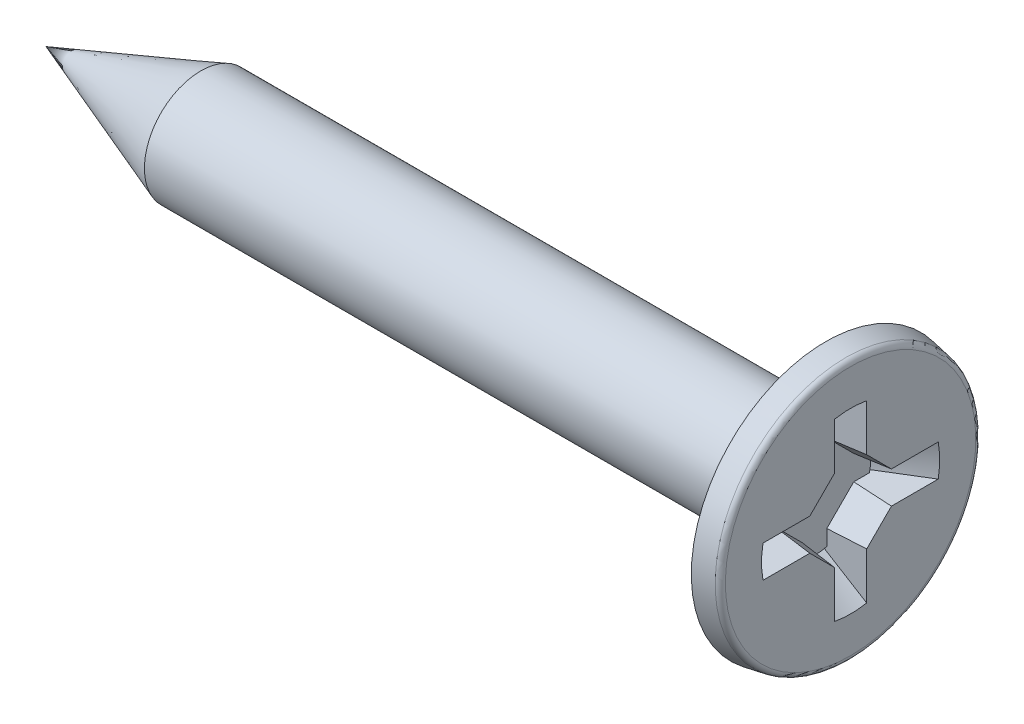
ISO-10303-21;
HEADER;
FILE_DESCRIPTION(('STEP AP214'),'2;1');
FILE_NAME('part.step','',(''),(''),'','','');
FILE_SCHEMA(('AUTOMOTIVE_DESIGN { 1 0 10303 214 1 1 1 1 }'));
ENDSEC;
DATA;
#1=APPLICATION_CONTEXT('core data for automotive mechanical design processes');
#2=APPLICATION_PROTOCOL_DEFINITION('international standard','automotive_design',2000,#1);
#3=PRODUCT_CONTEXT('',#1,'mechanical');
#4=PRODUCT('Part','Part','',(#3));
#5=PRODUCT_RELATED_PRODUCT_CATEGORY('part','',(#4));
#6=PRODUCT_DEFINITION_FORMATION('','',#4);
#7=PRODUCT_DEFINITION_CONTEXT('part definition',#1,'design');
#8=PRODUCT_DEFINITION('design','',#6,#7);
#9=PRODUCT_DEFINITION_SHAPE('','',#8);
#10=(LENGTH_UNIT() NAMED_UNIT(*) SI_UNIT(.MILLI.,.METRE.));
#11=(NAMED_UNIT(*) PLANE_ANGLE_UNIT() SI_UNIT($,.RADIAN.));
#12=(NAMED_UNIT(*) SI_UNIT($,.STERADIAN.) SOLID_ANGLE_UNIT());
#13=UNCERTAINTY_MEASURE_WITH_UNIT(LENGTH_MEASURE(1.E-05),#10,'distance_accuracy_value','');
#14=(GEOMETRIC_REPRESENTATION_CONTEXT(3) GLOBAL_UNCERTAINTY_ASSIGNED_CONTEXT((#13)) GLOBAL_UNIT_ASSIGNED_CONTEXT((#10,
#11,#12)) REPRESENTATION_CONTEXT('',''));
#15=CARTESIAN_POINT('',(0.,0.,0.));
#16=DIRECTION('',(0.,0.,1.));
#17=DIRECTION('',(1.,0.,0.));
#18=AXIS2_PLACEMENT_3D('',#15,#16,#17);
#19=CARTESIAN_POINT('',(21.0058,0.,0.));
#20=DIRECTION('',(1.,0.,0.));
#21=DIRECTION('',(0.,0.,-1.));
#22=AXIS2_PLACEMENT_3D('',#19,#20,#21);
#23=CONICAL_SURFACE('',#22,0.25035654622939,0.667320149050341);
#24=CARTESIAN_POINT('',(22.9446761804665,0.,0.));
#25=DIRECTION('',(1.,0.,0.));
#26=DIRECTION('',(0.,0.,-1.));
#27=AXIS2_PLACEMENT_3D('',#24,#25,#26);
#28=CIRCLE('',#27,1.778);
#29=CARTESIAN_POINT('',(22.9446761804665,1.73906089050964,-0.370069208527001));
#30=VERTEX_POINT('',#29);
#31=CARTESIAN_POINT('',(22.9446761804665,1.73906089050964,0.370069208527007));
#32=VERTEX_POINT('',#31);
#33=EDGE_CURVE('E47',#30,#32,#28,.T.);
#34=ORIENTED_EDGE('',*,*,#33,.F.);
#35=CARTESIAN_POINT('',(24.257,2.76571478102859,-0.508));
#36=CARTESIAN_POINT('',(24.0903738580114,2.63544862131671,-0.490486886771015));
#37=CARTESIAN_POINT('',(23.9237562176942,2.50517146963506,-0.472974667103702));
#38=CARTESIAN_POINT('',(23.590554741965,2.24457356091985,-0.437953780807795));
#39=CARTESIAN_POINT('',(23.423970906544,2.11425280389808,-0.420445114178242));
#40=CARTESIAN_POINT('',(23.090853705786,1.85354595646584,-0.385433085538732));
#41=CARTESIAN_POINT('',(22.9243203404631,1.72315986603717,-0.367929723530254));
#42=CARTESIAN_POINT('',(22.59136931793,1.46223832418929,-0.332935160925983));
#43=CARTESIAN_POINT('',(22.424951660755,1.33170287272448,-0.315443960333905));
#44=CARTESIAN_POINT('',(22.2586245043183,1.20105074856376,-0.297962271752712));
#45=B_SPLINE_CURVE_WITH_KNOTS('',3,(#35,#36,#37,#38,#39,#40,#41,#42,#43,#44),.UNSPECIFIED.,.F.,
.F.,(4,2,2,2,4),(0.,0.636680661921654,1.27336115205289,1.91004181972966,2.54672268184246),.UNSPECIFIED.);
#46=CARTESIAN_POINT('',(24.257,2.76571478102859,-0.508));
#47=VERTEX_POINT('',#46);
#48=EDGE_CURVE('E189',#47,#30,#45,.T.);
#49=ORIENTED_EDGE('',*,*,#48,.F.);
#50=CARTESIAN_POINT('',(24.257,0.,0.));
#51=DIRECTION('',(1.,0.,0.));
#52=DIRECTION('',(0.,0.,-1.));
#53=AXIS2_PLACEMENT_3D('',#50,#51,#52);
#54=CIRCLE('',#53,2.81198190783653);
#55=CARTESIAN_POINT('',(24.257,2.76571478102858,0.50800000000001));
#56=VERTEX_POINT('',#55);
#57=EDGE_CURVE('E327',#47,#56,#54,.T.);
#58=ORIENTED_EDGE('',*,*,#57,.T.);
#59=CARTESIAN_POINT('',(22.2586245043184,1.20105074856377,0.297962271752717));
#60=CARTESIAN_POINT('',(22.4583226612367,1.35790009580057,0.318951393819583));
#61=CARTESIAN_POINT('',(22.6581405053032,1.51459509741993,0.339953095512631));
#62=CARTESIAN_POINT('',(23.0579235031304,1.82779489553756,0.381971981771476));
#63=CARTESIAN_POINT('',(23.2578886568436,1.98429969209706,0.402989166332286));
#64=CARTESIAN_POINT('',(23.5910468145409,2.24495362073449,0.438005499719591));
#65=CARTESIAN_POINT('',(23.7242244068001,2.34912268569443,0.452003028708519));
#66=CARTESIAN_POINT('',(23.9905989722724,2.55743581022851,0.480000123706706));
#67=CARTESIAN_POINT('',(24.123795945489,2.66157986979805,0.493999689716341));
#68=CARTESIAN_POINT('',(24.257,2.76571478102858,0.50800000000001));
#69=B_SPLINE_CURVE_WITH_KNOTS('',3,(#59,#60,#61,#62,#63,#64,#65,#66,#67,#68),.UNSPECIFIED.,.F.,
.F.,(4,2,2,2,4),(0.,0.764391301047044,1.52878235599137,2.03775246160172,2.5467226607872),.UNSPECIFIED.);
#70=EDGE_CURVE('E234',#32,#56,#69,.T.);
#71=ORIENTED_EDGE('',*,*,#70,.F.);
#72=EDGE_LOOP('',(#34,#49,#58,#71));
#73=FACE_BOUND('',#72,.T.);
#74=ADVANCED_FACE('F39',(#73),#23,.F.);
#75=CARTESIAN_POINT('',(22.9446761804665,0.370069208526994,1.73906089050964));
#76=VERTEX_POINT('',#75);
#77=CARTESIAN_POINT('',(22.9446761804665,-0.370069208527013,1.73906089050964));
#78=VERTEX_POINT('',#77);
#79=EDGE_CURVE('E205',#76,#78,#28,.T.);
#80=ORIENTED_EDGE('',*,*,#79,.F.);
#81=CARTESIAN_POINT('',(24.257,0.50799999999999,2.76571478102859));
#82=CARTESIAN_POINT('',(24.0903738580114,0.490486886771005,2.63544862131672));
#83=CARTESIAN_POINT('',(23.9237562176942,0.472974667103693,2.50517146963506));
#84=CARTESIAN_POINT('',(23.590554741965,0.437953780807786,2.24457356091985));
#85=CARTESIAN_POINT('',(23.423970906544,0.420445114178234,2.11425280389808));
#86=CARTESIAN_POINT('',(23.090853705786,0.385433085538724,1.85354595646584));
#87=CARTESIAN_POINT('',(22.9243203404631,0.367929723530247,1.72315986603717));
#88=CARTESIAN_POINT('',(22.59136931793,0.332935160925977,1.46223832418929));
#89=CARTESIAN_POINT('',(22.424951660755,0.315443960333899,1.33170287272448));
#90=CARTESIAN_POINT('',(22.2586245043183,0.297962271752708,1.20105074856377));
#91=B_SPLINE_CURVE_WITH_KNOTS('',3,(#81,#82,#83,#84,#85,#86,#87,#88,#89,#90),.UNSPECIFIED.,.F.,
.F.,(4,2,2,2,4),(0.,0.636680661921654,1.27336115205289,1.91004181972966,2.54672268184246),.UNSPECIFIED.);
#92=CARTESIAN_POINT('',(24.257,0.50799999999999,2.76571478102859));
#93=VERTEX_POINT('',#92);
#94=EDGE_CURVE('E190',#93,#76,#91,.T.);
#95=ORIENTED_EDGE('',*,*,#94,.F.);
#96=CARTESIAN_POINT('',(24.257,-0.50800000000002,2.76571478102858));
#97=VERTEX_POINT('',#96);
#98=EDGE_CURVE('E397',#93,#97,#54,.T.);
#99=ORIENTED_EDGE('',*,*,#98,.T.);
#100=CARTESIAN_POINT('',(22.2586245043184,-0.297962271752722,1.20105074856377));
#101=CARTESIAN_POINT('',(22.4583226612367,-0.318951393819589,1.35790009580057));
#102=CARTESIAN_POINT('',(22.6581405053032,-0.339953095512637,1.51459509741993));
#103=CARTESIAN_POINT('',(23.0579235031304,-0.381971981771484,1.82779489553756));
#104=CARTESIAN_POINT('',(23.2578886568436,-0.402989166332294,1.98429969209706));
#105=CARTESIAN_POINT('',(23.5910468145409,-0.438005499719601,2.24495362073449));
#106=CARTESIAN_POINT('',(23.7242244068001,-0.452003028708528,2.34912268569443));
#107=CARTESIAN_POINT('',(23.9905989722724,-0.480000123706716,2.55743581022851));
#108=CARTESIAN_POINT('',(24.123795945489,-0.493999689716351,2.66157986979805));
#109=CARTESIAN_POINT('',(24.257,-0.50800000000002,2.76571478102858));
#110=B_SPLINE_CURVE_WITH_KNOTS('',3,(#100,#101,#102,#103,#104,#105,#106,#107,#108,#109),
.UNSPECIFIED.,.F.,.F.,(4,2,2,2,4),(0.,0.764391301047045,1.52878235599138,2.03775246160172,
2.54672266078719),.UNSPECIFIED.);
#111=EDGE_CURVE('E227',#78,#97,#110,.T.);
#112=ORIENTED_EDGE('',*,*,#111,.F.);
#113=EDGE_LOOP('',(#80,#95,#99,#112));
#114=FACE_BOUND('',#113,.T.);
#115=ADVANCED_FACE('F224',(#114),#23,.F.);
#116=CARTESIAN_POINT('',(22.9446761804665,-1.73906089050965,0.370069208526989));
#117=VERTEX_POINT('',#116);
#118=CARTESIAN_POINT('',(22.9446761804665,-1.73906089050964,-0.370069208527019));
#119=VERTEX_POINT('',#118);
#120=EDGE_CURVE('E202',#117,#119,#28,.T.);
#121=ORIENTED_EDGE('',*,*,#120,.F.);
#122=CARTESIAN_POINT('',(24.257,-2.76571478102859,0.507999999999981));
#123=CARTESIAN_POINT('',(24.0903738580114,-2.63544862131672,0.490486886770996));
#124=CARTESIAN_POINT('',(23.9237562176942,-2.50517146963506,0.472974667103685));
#125=CARTESIAN_POINT('',(23.590554741965,-2.24457356091985,0.437953780807779));
#126=CARTESIAN_POINT('',(23.423970906544,-2.11425280389808,0.420445114178227));
#127=CARTESIAN_POINT('',(23.090853705786,-1.85354595646584,0.385433085538719));
#128=CARTESIAN_POINT('',(22.9243203404631,-1.72315986603717,0.367929723530242));
#129=CARTESIAN_POINT('',(22.59136931793,-1.46223832418929,0.332935160925972));
#130=CARTESIAN_POINT('',(22.424951660755,-1.33170287272448,0.315443960333895));
#131=CARTESIAN_POINT('',(22.2586245043183,-1.20105074856377,0.297962271752704));
#132=B_SPLINE_CURVE_WITH_KNOTS('',3,(#122,#123,#124,#125,#126,#127,#128,#129,#130,#131),
.UNSPECIFIED.,.F.,.F.,(4,2,2,2,4),(0.,0.636680661921654,1.27336115205289,1.91004181972966,
2.54672268184246),.UNSPECIFIED.);
#133=CARTESIAN_POINT('',(24.257,-2.76571478102859,0.507999999999981));
#134=VERTEX_POINT('',#133);
#135=EDGE_CURVE('E236',#134,#117,#132,.T.);
#136=ORIENTED_EDGE('',*,*,#135,.F.);
#137=CARTESIAN_POINT('',(24.257,-2.76571478102858,-0.508000000000029));
#138=VERTEX_POINT('',#137);
#139=EDGE_CURVE('E393',#134,#138,#54,.T.);
#140=ORIENTED_EDGE('',*,*,#139,.T.);
#141=CARTESIAN_POINT('',(22.2586245043184,-1.20105074856377,-0.297962271752725));
#142=CARTESIAN_POINT('',(22.4583226612367,-1.35790009580057,-0.318951393819593));
#143=CARTESIAN_POINT('',(22.6581405053032,-1.51459509741993,-0.339953095512642));
#144=CARTESIAN_POINT('',(23.0579235031304,-1.82779489553756,-0.38197198177149));
#145=CARTESIAN_POINT('',(23.2578886568436,-1.98429969209706,-0.402989166332301));
#146=CARTESIAN_POINT('',(23.5910468145409,-2.24495362073449,-0.438005499719608));
#147=CARTESIAN_POINT('',(23.7242244068001,-2.34912268569443,-0.452003028708535));
#148=CARTESIAN_POINT('',(23.9905989722724,-2.55743581022851,-0.480000123706724));
#149=CARTESIAN_POINT('',(24.123795945489,-2.66157986979805,-0.493999689716359));
#150=CARTESIAN_POINT('',(24.257,-2.76571478102858,-0.508000000000029));
#151=B_SPLINE_CURVE_WITH_KNOTS('',3,(#141,#142,#143,#144,#145,#146,#147,#148,#149,#150),
.UNSPECIFIED.,.F.,.F.,(4,2,2,2,4),(0.,0.764391301047045,1.52878235599138,2.03775246160172,
2.54672266078719),.UNSPECIFIED.);
#152=EDGE_CURVE('E322',#119,#138,#151,.T.);
#153=ORIENTED_EDGE('',*,*,#152,.F.);
#154=EDGE_LOOP('',(#121,#136,#140,#153));
#155=FACE_BOUND('',#154,.T.);
#156=ADVANCED_FACE('F261',(#155),#23,.F.);
#157=CARTESIAN_POINT('',(20.2438,0.,0.));
#158=DIRECTION('',(-1.,0.,0.));
#159=DIRECTION('',(0.,-1.,0.));
#160=AXIS2_PLACEMENT_3D('',#157,#158,#159);
#161=TOROIDAL_SURFACE('',#160,4.2418,3.2258);
#162=CARTESIAN_POINT('',(22.325980395643,0.,0.));
#163=DIRECTION('',(-1.,0.,0.));
#164=DIRECTION('',(0.,-1.,0.));
#165=AXIS2_PLACEMENT_3D('',#162,#163,#164);
#166=CIRCLE('',#165,1.778);
#167=CARTESIAN_POINT('',(22.325980395643,-1.778,0.));
#168=VERTEX_POINT('',#167);
#169=EDGE_CURVE('E410',#168,#168,#166,.F.);
#170=ORIENTED_EDGE('',*,*,#169,.T.);
#171=EDGE_LOOP('',(#170));
#172=FACE_BOUND('',#171,.T.);
#173=CARTESIAN_POINT('',(23.4696,0.,0.));
#174=DIRECTION('',(-1.,0.,0.));
#175=DIRECTION('',(0.,-1.,0.));
#176=AXIS2_PLACEMENT_3D('',#173,#174,#175);
#177=CIRCLE('',#176,4.2418);
#178=CARTESIAN_POINT('',(23.4696,-4.2418,0.));
#179=VERTEX_POINT('',#178);
#180=EDGE_CURVE('E372',#179,#179,#177,.T.);
#181=ORIENTED_EDGE('',*,*,#180,.T.);
#182=EDGE_LOOP('',(#181));
#183=FACE_BOUND('',#182,.T.);
#184=ADVANCED_FACE('F264',(#172,#183),#161,.F.);
#185=CARTESIAN_POINT('',(24.257,0.,0.));
#186=DIRECTION('',(-1.,0.,0.));
#187=DIRECTION('',(0.,-1.,0.));
#188=AXIS2_PLACEMENT_3D('',#185,#186,#187);
#189=PLANE('',#188);
#190=CARTESIAN_POINT('',(24.257,0.,0.));
#191=DIRECTION('',(-1.,0.,0.));
#192=DIRECTION('',(0.,-1.,0.));
#193=AXIS2_PLACEMENT_3D('',#190,#191,#192);
#194=CIRCLE('',#193,3.95376822096684);
#195=CARTESIAN_POINT('',(24.257,-3.95376822096684,0.));
#196=VERTEX_POINT('',#195);
#197=EDGE_CURVE('E203',#196,#196,#194,.F.);
#198=ORIENTED_EDGE('',*,*,#197,.T.);
#199=EDGE_LOOP('',(#198));
#200=FACE_BOUND('',#199,.T.);
#201=DIRECTION('',(0.,0.,-1.));
#202=VECTOR('',#201,1.);
#203=CARTESIAN_POINT('',(24.257,-0.50800000000002,2.81198190783653));
#204=LINE('',#203,#202);
#205=CARTESIAN_POINT('',(24.257,-0.50800000000001,1.28805122421383));
#206=VERTEX_POINT('',#205);
#207=EDGE_CURVE('E334',#97,#206,#204,.T.);
#208=ORIENTED_EDGE('',*,*,#207,.F.);
#209=ORIENTED_EDGE('',*,*,#98,.F.);
#210=DIRECTION('',(0.,0.,1.));
#211=VECTOR('',#210,1.);
#212=CARTESIAN_POINT('',(24.257,0.507999999999989,2.81198190783654));
#213=LINE('',#212,#211);
#214=CARTESIAN_POINT('',(24.257,0.507999999999995,1.28805122421383));
#215=VERTEX_POINT('',#214);
#216=EDGE_CURVE('E233',#215,#93,#213,.T.);
#217=ORIENTED_EDGE('',*,*,#216,.F.);
#218=DIRECTION('',(0.,-0.707106781186551,0.707106781186544));
#219=VECTOR('',#218,1.);
#220=CARTESIAN_POINT('',(24.257,0.507999999999995,1.28805122421383));
#221=LINE('',#220,#219);
#222=CARTESIAN_POINT('',(24.257,1.28805122421383,0.508000000000004));
#223=VERTEX_POINT('',#222);
#224=EDGE_CURVE('E356',#223,#215,#221,.T.);
#225=ORIENTED_EDGE('',*,*,#224,.F.);
#226=DIRECTION('',(0.,-1.,0.));
#227=VECTOR('',#226,1.);
#228=CARTESIAN_POINT('',(24.257,2.81198190783653,0.50800000000001));
#229=LINE('',#228,#227);
#230=EDGE_CURVE('E353',#56,#223,#229,.T.);
#231=ORIENTED_EDGE('',*,*,#230,.F.);
#232=ORIENTED_EDGE('',*,*,#57,.F.);
#233=DIRECTION('',(0.,1.,0.));
#234=VECTOR('',#233,1.);
#235=CARTESIAN_POINT('',(24.257,2.81198190783653,-0.508));
#236=LINE('',#235,#234);
#237=CARTESIAN_POINT('',(24.257,1.28805122421383,-0.508));
#238=VERTEX_POINT('',#237);
#239=EDGE_CURVE('E368',#238,#47,#236,.T.);
#240=ORIENTED_EDGE('',*,*,#239,.F.);
#241=DIRECTION('',(0.,0.707106781186546,0.707106781186549));
#242=VECTOR('',#241,1.);
#243=CARTESIAN_POINT('',(24.257,1.28805122421383,-0.508));
#244=LINE('',#243,#242);
#245=CARTESIAN_POINT('',(24.257,0.507999999999999,-1.28805122421383));
#246=VERTEX_POINT('',#245);
#247=EDGE_CURVE('E364',#246,#238,#244,.T.);
#248=ORIENTED_EDGE('',*,*,#247,.F.);
#249=DIRECTION('',(0.,0.,1.));
#250=VECTOR('',#249,1.);
#251=CARTESIAN_POINT('',(24.257,0.507999999999999,-2.81198190783654));
#252=LINE('',#251,#250);
#253=CARTESIAN_POINT('',(24.257,0.507999999999999,-2.76571478102859));
#254=VERTEX_POINT('',#253);
#255=EDGE_CURVE('E362',#254,#246,#252,.T.);
#256=ORIENTED_EDGE('',*,*,#255,.F.);
#257=CARTESIAN_POINT('',(24.257,-0.507999999999972,-2.76571478102859));
#258=VERTEX_POINT('',#257);
#259=EDGE_CURVE('E186',#258,#254,#54,.T.);
#260=ORIENTED_EDGE('',*,*,#259,.F.);
#261=DIRECTION('',(0.,0.,-1.));
#262=VECTOR('',#261,1.);
#263=CARTESIAN_POINT('',(24.257,-0.507999999999971,-2.81198190783654));
#264=LINE('',#263,#262);
#265=CARTESIAN_POINT('',(24.257,-0.507999999999988,-1.28805122421383));
#266=VERTEX_POINT('',#265);
#267=EDGE_CURVE('E329',#266,#258,#264,.T.);
#268=ORIENTED_EDGE('',*,*,#267,.F.);
#269=DIRECTION('',(0.,0.707106781186556,-0.707106781186539));
#270=VECTOR('',#269,1.);
#271=CARTESIAN_POINT('',(24.257,-0.507999999999988,-1.28805122421383));
#272=LINE('',#271,#270);
#273=CARTESIAN_POINT('',(24.257,-1.28805122421383,-0.508000000000013));
#274=VERTEX_POINT('',#273);
#275=EDGE_CURVE('E336',#274,#266,#272,.T.);
#276=ORIENTED_EDGE('',*,*,#275,.F.);
#277=DIRECTION('',(0.,1.,0.));
#278=VECTOR('',#277,1.);
#279=CARTESIAN_POINT('',(24.257,-2.81198190783653,-0.508000000000029));
#280=LINE('',#279,#278);
#281=EDGE_CURVE('E340',#138,#274,#280,.T.);
#282=ORIENTED_EDGE('',*,*,#281,.F.);
#283=ORIENTED_EDGE('',*,*,#139,.F.);
#284=DIRECTION('',(0.,-1.,0.));
#285=VECTOR('',#284,1.);
#286=CARTESIAN_POINT('',(24.257,-2.81198190783654,0.50799999999998));
#287=LINE('',#286,#285);
#288=CARTESIAN_POINT('',(24.257,-1.28805122421383,0.507999999999991));
#289=VERTEX_POINT('',#288);
#290=EDGE_CURVE('E349',#289,#134,#287,.T.);
#291=ORIENTED_EDGE('',*,*,#290,.F.);
#292=DIRECTION('',(0.,-0.707106781186541,-0.707106781186554));
#293=VECTOR('',#292,1.);
#294=CARTESIAN_POINT('',(24.257,-1.28805122421383,0.507999999999991));
#295=LINE('',#294,#293);
#296=EDGE_CURVE('E346',#206,#289,#295,.T.);
#297=ORIENTED_EDGE('',*,*,#296,.F.);
#298=EDGE_LOOP('',(#208,#209,#217,#225,#231,#232,#240,#248,#256,#260,#268,#276,#282,#283,#291,#297));
#299=FACE_BOUND('',#298,.T.);
#300=ADVANCED_FACE('F390',(#200,#299),#189,.F.);
#301=CARTESIAN_POINT('',(24.257,0.,0.));
#302=DIRECTION('',(-1.,0.,0.));
#303=DIRECTION('',(0.,-1.,0.));
#304=AXIS2_PLACEMENT_3D('',#301,#302,#303);
#305=CONICAL_SURFACE('',#304,4.10296013539016,0.174532925199427);
#306=CARTESIAN_POINT('',(24.1100746459892,0.,0.));
#307=DIRECTION('',(1.,0.,0.));
#308=DIRECTION('',(0.,1.,0.));
#309=AXIS2_PLACEMENT_3D('',#306,#307,#308);
#310=CIRCLE('',#309,4.12886703945241);
#311=CARTESIAN_POINT('',(24.1100746459892,4.12886703945241,0.));
#312=VERTEX_POINT('',#311);
#313=EDGE_CURVE('E207',#312,#312,#310,.F.);
#314=ORIENTED_EDGE('',*,*,#313,.T.);
#315=EDGE_LOOP('',(#314));
#316=FACE_BOUND('',#315,.T.);
#317=ORIENTED_EDGE('',*,*,#180,.F.);
#318=EDGE_LOOP('',(#317));
#319=FACE_BOUND('',#318,.T.);
#320=ADVANCED_FACE('F518',(#316,#319),#305,.T.);
#321=CARTESIAN_POINT('',(24.257,2.81198190783653,-0.508));
#322=DIRECTION('',(0.104528463267654,0.,0.994521895368273));
#323=DIRECTION('',(0.994521895368273,0.,-0.104528463267654));
#324=AXIS2_PLACEMENT_3D('',#321,#322,#323);
#325=PLANE('',#324);
#326=CARTESIAN_POINT('',(19.4237028572549,0.,0.));
#327=DIRECTION('',(0.104528463267654,0.,0.994521895368273));
#328=DIRECTION('',(0.994521895368273,0.,-0.104528463267654));
#329=AXIS2_PLACEMENT_3D('',#326,#327,#328);
#330=ELLIPSE('',#329,17.0097210311729,1.778);
#331=CARTESIAN_POINT('',(23.1175035293461,1.73509604563699,-0.388234094863988));
#332=VERTEX_POINT('',#331);
#333=EDGE_CURVE('E54',#30,#332,#330,.F.);
#334=ORIENTED_EDGE('',*,*,#333,.T.);
#335=DIRECTION('',(0.,1.,0.));
#336=VECTOR('',#335,1.);
#337=CARTESIAN_POINT('',(23.1175035293461,2.81198190783653,-0.388234094863987));
#338=LINE('',#337,#336);
#339=CARTESIAN_POINT('',(23.1175035293461,1.2384425619966,-0.388234094863988));
#340=VERTEX_POINT('',#339);
#341=EDGE_CURVE('E399',#332,#340,#338,.F.);
#342=ORIENTED_EDGE('',*,*,#341,.T.);
#343=DIRECTION('',(0.993591018949577,0.0432565808763364,-0.10443062421354));
#344=VECTOR('',#343,1.);
#345=CARTESIAN_POINT('',(24.3224975506374,1.29090269936035,-0.514884069971518));
#346=LINE('',#345,#344);
#347=EDGE_CURVE('E251',#340,#238,#346,.T.);
#348=ORIENTED_EDGE('',*,*,#347,.T.);
#349=ORIENTED_EDGE('',*,*,#239,.T.);
#350=ORIENTED_EDGE('',*,*,#48,.T.);
#351=EDGE_LOOP('',(#334,#342,#348,#349,#350));
#352=FACE_BOUND('',#351,.T.);
#353=ADVANCED_FACE('F313',(#352),#325,.T.);
#354=CARTESIAN_POINT('',(24.257,0.507999999999999,-2.81198190783654));
#355=DIRECTION('',(0.104528463267654,-0.994521895368273,0.));
#356=DIRECTION('',(0.994521895368273,0.104528463267654,0.));
#357=AXIS2_PLACEMENT_3D('',#354,#355,#356);
#358=PLANE('',#357);
#359=DIRECTION('',(0.993591018949577,0.10443062421354,-0.0432565808763362));
#360=VECTOR('',#359,1.);
#361=CARTESIAN_POINT('',(24.3044130579502,0.512983313197465,-1.29011538012577));
#362=LINE('',#361,#360);
#363=CARTESIAN_POINT('',(23.1175035293461,0.388234094863986,-1.23844256199661));
#364=VERTEX_POINT('',#363);
#365=EDGE_CURVE('E371',#364,#246,#362,.T.);
#366=ORIENTED_EDGE('',*,*,#365,.F.);
#367=DIRECTION('',(0.,0.,1.));
#368=VECTOR('',#367,1.);
#369=CARTESIAN_POINT('',(23.1175035293461,0.388234094863987,-2.81198190783654));
#370=LINE('',#369,#368);
#371=CARTESIAN_POINT('',(23.1175035293461,0.388234094863986,-1.73509604563699));
#372=VERTEX_POINT('',#371);
#373=EDGE_CURVE('E62',#364,#372,#370,.F.);
#374=ORIENTED_EDGE('',*,*,#373,.T.);
#375=CARTESIAN_POINT('',(19.4237028572549,0.,0.));
#376=DIRECTION('',(0.104528463267654,-0.994521895368273,0.));
#377=DIRECTION('',(0.994521895368273,0.104528463267654,0.));
#378=AXIS2_PLACEMENT_3D('',#375,#376,#377);
#379=ELLIPSE('',#378,17.009721031173,1.778);
#380=CARTESIAN_POINT('',(22.9446761804665,0.370069208527,-1.73906089050964));
#381=VERTEX_POINT('',#380);
#382=EDGE_CURVE('E192',#372,#381,#379,.F.);
#383=ORIENTED_EDGE('',*,*,#382,.T.);
#384=CARTESIAN_POINT('',(22.2586245043184,0.297962271752712,-1.20105074856377));
#385=CARTESIAN_POINT('',(22.4583226612367,0.318951393819578,-1.35790009580057));
#386=CARTESIAN_POINT('',(22.6581405053032,0.339953095512625,-1.51459509741994));
#387=CARTESIAN_POINT('',(23.0579235031304,0.38197198177147,-1.82779489553757));
#388=CARTESIAN_POINT('',(23.2578886568436,0.402989166332279,-1.98429969209706));
#389=CARTESIAN_POINT('',(23.5910468145409,0.438005499719583,-2.2449536207345));
#390=CARTESIAN_POINT('',(23.7242244068001,0.45200302870851,-2.34912268569443));
#391=CARTESIAN_POINT('',(23.9905989722724,0.480000123706697,-2.55743581022851));
#392=CARTESIAN_POINT('',(24.123795945489,0.493999689716331,-2.66157986979805));
#393=CARTESIAN_POINT('',(24.257,0.507999999999999,-2.76571478102859));
#394=B_SPLINE_CURVE_WITH_KNOTS('',3,(#384,#385,#386,#387,#388,#389,#390,#391,#392,#393),
.UNSPECIFIED.,.F.,.F.,(4,2,2,2,4),(0.,0.764391301047045,1.52878235599138,2.03775246160172,
2.54672266078719),.UNSPECIFIED.);
#395=EDGE_CURVE('E180',#381,#254,#394,.T.);
#396=ORIENTED_EDGE('',*,*,#395,.T.);
#397=ORIENTED_EDGE('',*,*,#255,.T.);
#398=EDGE_LOOP('',(#366,#374,#383,#396,#397));
#399=FACE_BOUND('',#398,.T.);
#400=ADVANCED_FACE('F193',(#399),#358,.T.);
#401=CARTESIAN_POINT('',(24.257,1.28805122421383,-0.508));
#402=DIRECTION('',(0.104528463267654,-0.703233176253406,0.703233176253403));
#403=DIRECTION('',(0.,-0.707106781186546,-0.707106781186549));
#404=AXIS2_PLACEMENT_3D('',#401,#402,#403);
#405=PLANE('',#404);
#406=ORIENTED_EDGE('',*,*,#347,.F.);
#407=DIRECTION('',(0.,0.707106781186546,0.707106781186549));
#408=VECTOR('',#407,1.);
#409=CARTESIAN_POINT('',(23.1175035293461,1.20336394053721,-0.423312716323381));
#410=LINE('',#409,#408);
#411=EDGE_CURVE('E433',#340,#364,#410,.F.);
#412=ORIENTED_EDGE('',*,*,#411,.T.);
#413=ORIENTED_EDGE('',*,*,#365,.T.);
#414=ORIENTED_EDGE('',*,*,#247,.T.);
#415=EDGE_LOOP('',(#406,#412,#413,#414));
#416=FACE_BOUND('',#415,.T.);
#417=ADVANCED_FACE('F312',(#416),#405,.T.);
#418=CARTESIAN_POINT('',(24.257,0.507999999999989,2.81198190783654));
#419=DIRECTION('',(0.104528463267654,-0.994521895368273,0.));
#420=DIRECTION('',(0.994521895368273,0.104528463267654,0.));
#421=AXIS2_PLACEMENT_3D('',#418,#419,#420);
#422=PLANE('',#421);
#423=CARTESIAN_POINT('',(19.4237028572549,0.,0.));
#424=DIRECTION('',(0.104528463267654,-0.994521895368273,0.));
#425=DIRECTION('',(0.994521895368273,0.104528463267654,0.));
#426=AXIS2_PLACEMENT_3D('',#423,#424,#425);
#427=ELLIPSE('',#426,17.009721031173,1.778);
#428=CARTESIAN_POINT('',(23.1175035293461,0.388234094863981,1.735096045637));
#429=VERTEX_POINT('',#428);
#430=EDGE_CURVE('E220',#76,#429,#427,.F.);
#431=ORIENTED_EDGE('',*,*,#430,.T.);
#432=DIRECTION('',(0.,0.,1.));
#433=VECTOR('',#432,1.);
#434=CARTESIAN_POINT('',(23.1175035293461,0.388234094863977,2.81198190783654));
#435=LINE('',#434,#433);
#436=CARTESIAN_POINT('',(23.1175035293461,0.388234094863983,1.2384425619966));
#437=VERTEX_POINT('',#436);
#438=EDGE_CURVE('E431',#429,#437,#435,.F.);
#439=ORIENTED_EDGE('',*,*,#438,.T.);
#440=DIRECTION('',(0.993591018949577,0.10443062421354,0.0432565808763368));
#441=VECTOR('',#440,1.);
#442=CARTESIAN_POINT('',(24.3224975506374,0.514884069971513,1.29090269936036));
#443=LINE('',#442,#441);
#444=EDGE_CURVE('E365',#437,#215,#443,.T.);
#445=ORIENTED_EDGE('',*,*,#444,.T.);
#446=ORIENTED_EDGE('',*,*,#216,.T.);
#447=ORIENTED_EDGE('',*,*,#94,.T.);
#448=EDGE_LOOP('',(#431,#439,#445,#446,#447));
#449=FACE_BOUND('',#448,.T.);
#450=ADVANCED_FACE('F230',(#449),#422,.T.);
#451=CARTESIAN_POINT('',(24.257,2.81198190783653,0.50800000000001));
#452=DIRECTION('',(0.104528463267654,0.,-0.994521895368273));
#453=DIRECTION('',(-0.994521895368273,0.,-0.104528463267654));
#454=AXIS2_PLACEMENT_3D('',#451,#452,#453);
#455=PLANE('',#454);
#456=DIRECTION('',(0.993591018949577,0.0432565808763358,0.10443062421354));
#457=VECTOR('',#456,1.);
#458=CARTESIAN_POINT('',(24.3044130579502,1.29011538012577,0.512983313197471));
#459=LINE('',#458,#457);
#460=CARTESIAN_POINT('',(23.1175035293461,1.2384425619966,0.388234094863991));
#461=VERTEX_POINT('',#460);
#462=EDGE_CURVE('E361',#461,#223,#459,.T.);
#463=ORIENTED_EDGE('',*,*,#462,.F.);
#464=DIRECTION('',(0.,-1.,0.));
#465=VECTOR('',#464,1.);
#466=CARTESIAN_POINT('',(23.1175035293461,2.81198190783653,0.388234094863997));
#467=LINE('',#466,#465);
#468=CARTESIAN_POINT('',(23.1175035293461,1.73509604563699,0.388234094863993));
#469=VERTEX_POINT('',#468);
#470=EDGE_CURVE('E429',#461,#469,#467,.F.);
#471=ORIENTED_EDGE('',*,*,#470,.T.);
#472=CARTESIAN_POINT('',(19.4237028572549,0.,0.));
#473=DIRECTION('',(0.104528463267654,0.,-0.994521895368273));
#474=DIRECTION('',(0.994521895368273,0.,0.104528463267654));
#475=AXIS2_PLACEMENT_3D('',#472,#473,#474);
#476=ELLIPSE('',#475,17.0097210311729,1.778);
#477=EDGE_CURVE('E411',#469,#32,#476,.F.);
#478=ORIENTED_EDGE('',*,*,#477,.T.);
#479=ORIENTED_EDGE('',*,*,#70,.T.);
#480=ORIENTED_EDGE('',*,*,#230,.T.);
#481=EDGE_LOOP('',(#463,#471,#478,#479,#480));
#482=FACE_BOUND('',#481,.T.);
#483=ADVANCED_FACE('F459',(#482),#455,.T.);
#484=CARTESIAN_POINT('',(24.257,-2.81198190783654,0.50799999999998));
#485=DIRECTION('',(0.104528463267654,0.,-0.994521895368273));
#486=DIRECTION('',(-0.994521895368273,0.,-0.104528463267654));
#487=AXIS2_PLACEMENT_3D('',#484,#485,#486);
#488=PLANE('',#487);
#489=CARTESIAN_POINT('',(19.4237028572549,0.,0.));
#490=DIRECTION('',(0.104528463267654,0.,-0.994521895368273));
#491=DIRECTION('',(0.994521895368273,0.,0.104528463267654));
#492=AXIS2_PLACEMENT_3D('',#489,#490,#491);
#493=ELLIPSE('',#492,17.0097210311729,1.778);
#494=CARTESIAN_POINT('',(23.1175035293461,-1.735096045637,0.388234094863976));
#495=VERTEX_POINT('',#494);
#496=EDGE_CURVE('E477',#117,#495,#493,.F.);
#497=ORIENTED_EDGE('',*,*,#496,.T.);
#498=DIRECTION('',(0.,-1.,0.));
#499=VECTOR('',#498,1.);
#500=CARTESIAN_POINT('',(23.1175035293461,-2.81198190783654,0.388234094863968));
#501=LINE('',#500,#499);
#502=CARTESIAN_POINT('',(23.1175035293461,-1.2384425619966,0.388234094863979));
#503=VERTEX_POINT('',#502);
#504=EDGE_CURVE('E381',#495,#503,#501,.F.);
#505=ORIENTED_EDGE('',*,*,#504,.T.);
#506=DIRECTION('',(0.993591018949577,-0.0432565808763372,0.10443062421354));
#507=VECTOR('',#506,1.);
#508=CARTESIAN_POINT('',(24.3224975506374,-1.29090269936036,0.514884069971509));
#509=LINE('',#508,#507);
#510=EDGE_CURVE('E357',#503,#289,#509,.T.);
#511=ORIENTED_EDGE('',*,*,#510,.T.);
#512=ORIENTED_EDGE('',*,*,#290,.T.);
#513=ORIENTED_EDGE('',*,*,#135,.T.);
#514=EDGE_LOOP('',(#497,#505,#511,#512,#513));
#515=FACE_BOUND('',#514,.T.);
#516=ADVANCED_FACE('F377',(#515),#488,.T.);
#517=CARTESIAN_POINT('',(24.257,-0.50800000000002,2.81198190783653));
#518=DIRECTION('',(0.104528463267654,0.994521895368273,0.));
#519=DIRECTION('',(-0.994521895368273,0.104528463267654,0.));
#520=AXIS2_PLACEMENT_3D('',#517,#518,#519);
#521=PLANE('',#520);
#522=DIRECTION('',(0.993591018949577,-0.10443062421354,0.0432565808763355));
#523=VECTOR('',#522,1.);
#524=CARTESIAN_POINT('',(24.3044130579502,-0.512983313197476,1.29011538012577));
#525=LINE('',#524,#523);
#526=CARTESIAN_POINT('',(23.1175035293461,-0.388234094863996,1.2384425619966));
#527=VERTEX_POINT('',#526);
#528=EDGE_CURVE('E352',#527,#206,#525,.T.);
#529=ORIENTED_EDGE('',*,*,#528,.F.);
#530=DIRECTION('',(0.,0.,-1.));
#531=VECTOR('',#530,1.);
#532=CARTESIAN_POINT('',(23.1175035293461,-0.388234094864008,2.81198190783653));
#533=LINE('',#532,#531);
#534=CARTESIAN_POINT('',(23.1175035293461,-0.388234094864,1.73509604563699));
#535=VERTEX_POINT('',#534);
#536=EDGE_CURVE('E424',#527,#535,#533,.F.);
#537=ORIENTED_EDGE('',*,*,#536,.T.);
#538=CARTESIAN_POINT('',(19.4237028572549,0.,0.));
#539=DIRECTION('',(0.104528463267654,0.994521895368273,0.));
#540=DIRECTION('',(0.994521895368273,-0.104528463267654,0.));
#541=AXIS2_PLACEMENT_3D('',#538,#539,#540);
#542=ELLIPSE('',#541,17.0097210311729,1.778);
#543=EDGE_CURVE('E218',#535,#78,#542,.F.);
#544=ORIENTED_EDGE('',*,*,#543,.T.);
#545=ORIENTED_EDGE('',*,*,#111,.T.);
#546=ORIENTED_EDGE('',*,*,#207,.T.);
#547=EDGE_LOOP('',(#529,#537,#544,#545,#546));
#548=FACE_BOUND('',#547,.T.);
#549=ADVANCED_FACE('F462',(#548),#521,.T.);
#550=CARTESIAN_POINT('',(24.257,-0.507999999999971,-2.81198190783654));
#551=DIRECTION('',(0.104528463267654,0.994521895368273,0.));
#552=DIRECTION('',(-0.994521895368273,0.104528463267654,0.));
#553=AXIS2_PLACEMENT_3D('',#550,#551,#552);
#554=PLANE('',#553);
#555=CARTESIAN_POINT('',(19.4237028572549,0.,0.));
#556=DIRECTION('',(0.104528463267654,0.994521895368273,0.));
#557=DIRECTION('',(0.994521895368273,-0.104528463267654,0.));
#558=AXIS2_PLACEMENT_3D('',#555,#556,#557);
#559=ELLIPSE('',#558,17.0097210311729,1.778);
#560=CARTESIAN_POINT('',(22.9446761804665,-0.370069208526983,-1.73906089050965));
#561=VERTEX_POINT('',#560);
#562=CARTESIAN_POINT('',(23.1175035293461,-0.38823409486397,-1.735096045637));
#563=VERTEX_POINT('',#562);
#564=EDGE_CURVE('E198',#561,#563,#559,.F.);
#565=ORIENTED_EDGE('',*,*,#564,.T.);
#566=DIRECTION('',(0.,0.,-1.));
#567=VECTOR('',#566,1.);
#568=CARTESIAN_POINT('',(23.1175035293461,-0.388234094863959,-2.81198190783654));
#569=LINE('',#568,#567);
#570=CARTESIAN_POINT('',(23.1175035293461,-0.388234094863975,-1.23844256199661));
#571=VERTEX_POINT('',#570);
#572=EDGE_CURVE('E420',#563,#571,#569,.F.);
#573=ORIENTED_EDGE('',*,*,#572,.T.);
#574=DIRECTION('',(0.993591018949577,-0.104430624213539,-0.0432565808763375));
#575=VECTOR('',#574,1.);
#576=CARTESIAN_POINT('',(24.3224975506374,-0.514884069971506,-1.29090269936036));
#577=LINE('',#576,#575);
#578=EDGE_CURVE('E307',#571,#266,#577,.T.);
#579=ORIENTED_EDGE('',*,*,#578,.T.);
#580=ORIENTED_EDGE('',*,*,#267,.T.);
#581=CARTESIAN_POINT('',(24.257,-0.507999999999972,-2.76571478102859));
#582=CARTESIAN_POINT('',(24.0903738580114,-0.490486886770988,-2.63544862131672));
#583=CARTESIAN_POINT('',(23.9237562176942,-0.472974667103677,-2.50517146963506));
#584=CARTESIAN_POINT('',(23.590554741965,-0.437953780807772,-2.24457356091985));
#585=CARTESIAN_POINT('',(23.423970906544,-0.420445114178221,-2.11425280389808));
#586=CARTESIAN_POINT('',(23.090853705786,-0.385433085538713,-1.85354595646584));
#587=CARTESIAN_POINT('',(22.9243203404631,-0.367929723530237,-1.72315986603717));
#588=CARTESIAN_POINT('',(22.59136931793,-0.332935160925968,-1.46223832418929));
#589=CARTESIAN_POINT('',(22.424951660755,-0.315443960333892,-1.33170287272448));
#590=CARTESIAN_POINT('',(22.2586245043183,-0.297962271752701,-1.20105074856377));
#591=B_SPLINE_CURVE_WITH_KNOTS('',3,(#581,#582,#583,#584,#585,#586,#587,#588,#589,#590),
.UNSPECIFIED.,.F.,.F.,(4,2,2,2,4),(0.,0.636680661921656,1.27336115205289,1.91004181972966,
2.54672268184246),.UNSPECIFIED.);
#592=EDGE_CURVE('E269',#258,#561,#591,.T.);
#593=ORIENTED_EDGE('',*,*,#592,.T.);
#594=EDGE_LOOP('',(#565,#573,#579,#580,#593));
#595=FACE_BOUND('',#594,.T.);
#596=ADVANCED_FACE('F320',(#595),#554,.T.);
#597=CARTESIAN_POINT('',(24.257,-2.81198190783653,-0.508000000000029));
#598=DIRECTION('',(0.104528463267654,0.,0.994521895368273));
#599=DIRECTION('',(0.994521895368273,0.,-0.104528463267654));
#600=AXIS2_PLACEMENT_3D('',#597,#598,#599);
#601=PLANE('',#600);
#602=DIRECTION('',(0.993591018949577,-0.0432565808763351,-0.10443062421354));
#603=VECTOR('',#602,1.);
#604=CARTESIAN_POINT('',(24.3044130579502,-1.29011538012577,-0.51298331319748));
#605=LINE('',#604,#603);
#606=CARTESIAN_POINT('',(23.1175035293461,-1.2384425619966,-0.388234094864));
#607=VERTEX_POINT('',#606);
#608=EDGE_CURVE('E328',#607,#274,#605,.T.);
#609=ORIENTED_EDGE('',*,*,#608,.F.);
#610=DIRECTION('',(0.,1.,0.));
#611=VECTOR('',#610,1.);
#612=CARTESIAN_POINT('',(23.1175035293461,-2.81198190783653,-0.388234094864017));
#613=LINE('',#612,#611);
#614=CARTESIAN_POINT('',(23.1175035293461,-1.73509604563699,-0.388234094864006));
#615=VERTEX_POINT('',#614);
#616=EDGE_CURVE('E414',#607,#615,#613,.F.);
#617=ORIENTED_EDGE('',*,*,#616,.T.);
#618=CARTESIAN_POINT('',(19.4237028572549,0.,0.));
#619=DIRECTION('',(0.104528463267654,0.,0.994521895368273));
#620=DIRECTION('',(0.994521895368273,0.,-0.104528463267654));
#621=AXIS2_PLACEMENT_3D('',#618,#619,#620);
#622=ELLIPSE('',#621,17.0097210311729,1.778);
#623=EDGE_CURVE('E197',#615,#119,#622,.F.);
#624=ORIENTED_EDGE('',*,*,#623,.T.);
#625=ORIENTED_EDGE('',*,*,#152,.T.);
#626=ORIENTED_EDGE('',*,*,#281,.T.);
#627=EDGE_LOOP('',(#609,#617,#624,#625,#626));
#628=FACE_BOUND('',#627,.T.);
#629=ADVANCED_FACE('F315',(#628),#601,.T.);
#630=CARTESIAN_POINT('',(24.257,0.507999999999995,1.28805122421383));
#631=DIRECTION('',(0.104528463267654,-0.7032331762534,-0.703233176253408));
#632=DIRECTION('',(0.,0.707106781186551,-0.707106781186544));
#633=AXIS2_PLACEMENT_3D('',#630,#631,#632);
#634=PLANE('',#633);
#635=ORIENTED_EDGE('',*,*,#444,.F.);
#636=DIRECTION('',(0.,-0.707106781186551,0.707106781186544));
#637=VECTOR('',#636,1.);
#638=CARTESIAN_POINT('',(23.1175035293461,0.423312716323376,1.20336394053721));
#639=LINE('',#638,#637);
#640=EDGE_CURVE('E427',#437,#461,#639,.F.);
#641=ORIENTED_EDGE('',*,*,#640,.T.);
#642=ORIENTED_EDGE('',*,*,#462,.T.);
#643=ORIENTED_EDGE('',*,*,#224,.T.);
#644=EDGE_LOOP('',(#635,#641,#642,#643));
#645=FACE_BOUND('',#644,.T.);
#646=ADVANCED_FACE('F319',(#645),#634,.T.);
#647=CARTESIAN_POINT('',(24.257,-1.28805122421383,0.507999999999991));
#648=DIRECTION('',(0.104528463267654,0.70323317625341,-0.703233176253398));
#649=DIRECTION('',(0.,0.707106781186541,0.707106781186554));
#650=AXIS2_PLACEMENT_3D('',#647,#648,#649);
#651=PLANE('',#650);
#652=ORIENTED_EDGE('',*,*,#510,.F.);
#653=DIRECTION('',(0.,-0.707106781186541,-0.707106781186554));
#654=VECTOR('',#653,1.);
#655=CARTESIAN_POINT('',(23.1175035293461,-1.20336394053721,0.423312716323373));
#656=LINE('',#655,#654);
#657=EDGE_CURVE('E422',#503,#527,#656,.F.);
#658=ORIENTED_EDGE('',*,*,#657,.T.);
#659=ORIENTED_EDGE('',*,*,#528,.T.);
#660=ORIENTED_EDGE('',*,*,#296,.T.);
#661=EDGE_LOOP('',(#652,#658,#659,#660));
#662=FACE_BOUND('',#661,.T.);
#663=ADVANCED_FACE('F385',(#662),#651,.T.);
#664=CARTESIAN_POINT('',(24.257,-0.507999999999988,-1.28805122421383));
#665=DIRECTION('',(0.104528463267654,0.703233176253395,0.703233176253413));
#666=DIRECTION('',(0.,-0.707106781186556,0.707106781186539));
#667=AXIS2_PLACEMENT_3D('',#664,#665,#666);
#668=PLANE('',#667);
#669=ORIENTED_EDGE('',*,*,#578,.F.);
#670=DIRECTION('',(0.,0.707106781186556,-0.707106781186539));
#671=VECTOR('',#670,1.);
#672=CARTESIAN_POINT('',(23.1175035293461,-0.423312716323369,-1.20336394053721));
#673=LINE('',#672,#671);
#674=EDGE_CURVE('E11',#571,#607,#673,.F.);
#675=ORIENTED_EDGE('',*,*,#674,.T.);
#676=ORIENTED_EDGE('',*,*,#608,.T.);
#677=ORIENTED_EDGE('',*,*,#275,.T.);
#678=EDGE_LOOP('',(#669,#675,#676,#677));
#679=FACE_BOUND('',#678,.T.);
#680=ADVANCED_FACE('F260',(#679),#668,.T.);
#681=EDGE_CURVE('E183',#561,#381,#28,.T.);
#682=ORIENTED_EDGE('',*,*,#681,.F.);
#683=ORIENTED_EDGE('',*,*,#592,.F.);
#684=ORIENTED_EDGE('',*,*,#259,.T.);
#685=ORIENTED_EDGE('',*,*,#395,.F.);
#686=EDGE_LOOP('',(#682,#683,#684,#685));
#687=FACE_BOUND('',#686,.T.);
#688=ADVANCED_FACE('F181',(#687),#23,.F.);
#689=CARTESIAN_POINT('',(24.0792,0.,0.));
#690=DIRECTION('',(-1.,0.,0.));
#691=DIRECTION('',(0.,-1.,0.));
#692=AXIS2_PLACEMENT_3D('',#689,#690,#691);
#693=TOROIDAL_SURFACE('',#692,3.95376822096684,0.1778);
#694=ORIENTED_EDGE('',*,*,#197,.F.);
#695=EDGE_LOOP('',(#694));
#696=FACE_BOUND('',#695,.T.);
#697=ORIENTED_EDGE('',*,*,#313,.F.);
#698=EDGE_LOOP('',(#697));
#699=FACE_BOUND('',#698,.T.);
#700=ADVANCED_FACE('F41',(#696,#699),#693,.T.);
#701=CARTESIAN_POINT('',(23.1175035293461,0.,0.));
#702=DIRECTION('',(1.,0.,0.));
#703=DIRECTION('',(0.,0.,-1.));
#704=AXIS2_PLACEMENT_3D('',#701,#702,#703);
#705=CYLINDRICAL_SURFACE('',#704,1.778);
#706=ORIENTED_EDGE('',*,*,#382,.F.);
#707=CARTESIAN_POINT('',(23.1175035293461,0.,0.));
#708=DIRECTION('',(1.,0.,0.));
#709=DIRECTION('',(0.,0.,-1.));
#710=AXIS2_PLACEMENT_3D('',#707,#708,#709);
#711=CIRCLE('',#710,1.778);
#712=EDGE_CURVE('E440',#563,#372,#711,.T.);
#713=ORIENTED_EDGE('',*,*,#712,.F.);
#714=ORIENTED_EDGE('',*,*,#564,.F.);
#715=ORIENTED_EDGE('',*,*,#681,.T.);
#716=EDGE_LOOP('',(#706,#713,#714,#715));
#717=FACE_BOUND('',#716,.T.);
#718=ADVANCED_FACE('F201',(#717),#705,.T.);
#719=ORIENTED_EDGE('',*,*,#496,.F.);
#720=ORIENTED_EDGE('',*,*,#120,.T.);
#721=ORIENTED_EDGE('',*,*,#623,.F.);
#722=EDGE_CURVE('E442',#495,#615,#711,.T.);
#723=ORIENTED_EDGE('',*,*,#722,.F.);
#724=EDGE_LOOP('',(#719,#720,#721,#723));
#725=FACE_BOUND('',#724,.T.);
#726=ADVANCED_FACE('F479',(#725),#705,.T.);
#727=ORIENTED_EDGE('',*,*,#430,.F.);
#728=ORIENTED_EDGE('',*,*,#79,.T.);
#729=ORIENTED_EDGE('',*,*,#543,.F.);
#730=EDGE_CURVE('E446',#429,#535,#711,.T.);
#731=ORIENTED_EDGE('',*,*,#730,.F.);
#732=EDGE_LOOP('',(#727,#728,#729,#731));
#733=FACE_BOUND('',#732,.T.);
#734=ADVANCED_FACE('F216',(#733),#705,.T.);
#735=ORIENTED_EDGE('',*,*,#333,.F.);
#736=ORIENTED_EDGE('',*,*,#33,.T.);
#737=ORIENTED_EDGE('',*,*,#477,.F.);
#738=EDGE_CURVE('E409',#332,#469,#711,.T.);
#739=ORIENTED_EDGE('',*,*,#738,.F.);
#740=EDGE_LOOP('',(#735,#736,#737,#739));
#741=FACE_BOUND('',#740,.T.);
#742=ADVANCED_FACE('F407',(#741),#705,.T.);
#743=CARTESIAN_POINT('',(23.1175035293461,0.,-1.778));
#744=DIRECTION('',(1.,0.,0.));
#745=DIRECTION('',(0.,0.,-1.));
#746=AXIS2_PLACEMENT_3D('',#743,#744,#745);
#747=PLANE('',#746);
#748=ORIENTED_EDGE('',*,*,#341,.F.);
#749=ORIENTED_EDGE('',*,*,#738,.T.);
#750=ORIENTED_EDGE('',*,*,#470,.F.);
#751=ORIENTED_EDGE('',*,*,#640,.F.);
#752=ORIENTED_EDGE('',*,*,#438,.F.);
#753=ORIENTED_EDGE('',*,*,#730,.T.);
#754=ORIENTED_EDGE('',*,*,#536,.F.);
#755=ORIENTED_EDGE('',*,*,#657,.F.);
#756=ORIENTED_EDGE('',*,*,#504,.F.);
#757=ORIENTED_EDGE('',*,*,#722,.T.);
#758=ORIENTED_EDGE('',*,*,#616,.F.);
#759=ORIENTED_EDGE('',*,*,#674,.F.);
#760=ORIENTED_EDGE('',*,*,#572,.F.);
#761=ORIENTED_EDGE('',*,*,#712,.T.);
#762=ORIENTED_EDGE('',*,*,#373,.F.);
#763=ORIENTED_EDGE('',*,*,#411,.F.);
#764=EDGE_LOOP('',(#748,#749,#750,#751,#752,#753,#754,#755,#756,#757,#758,#759,#760,#761,#762,#763));
#765=FACE_BOUND('',#764,.T.);
#766=ADVANCED_FACE('F262',(#765),#747,.T.);
#767=CARTESIAN_POINT('',(3.7420148517904,0.,0.));
#768=DIRECTION('',(1.,0.,0.));
#769=DIRECTION('',(0.,0.,-1.));
#770=AXIS2_PLACEMENT_3D('',#767,#768,#769);
#771=CIRCLE('',#770,1.778);
#772=CARTESIAN_POINT('',(3.7420148517904,0.,-1.778));
#773=VERTEX_POINT('',#772);
#774=EDGE_CURVE('E443',#773,#773,#771,.T.);
#775=ORIENTED_EDGE('',*,*,#774,.T.);
#776=EDGE_LOOP('',(#775));
#777=FACE_BOUND('',#776,.T.);
#778=ORIENTED_EDGE('',*,*,#169,.F.);
#779=EDGE_LOOP('',(#778));
#780=FACE_BOUND('',#779,.T.);
#781=ADVANCED_FACE('F568',(#777,#780),#705,.T.);
#782=CARTESIAN_POINT('',(-1.143,0.,0.));
#783=DIRECTION('',(1.,0.,0.));
#784=DIRECTION('',(0.,0.,-1.));
#785=AXIS2_PLACEMENT_3D('',#782,#783,#784);
#786=CONICAL_SURFACE('',#785,0.,0.34906585039886);
#787=CARTESIAN_POINT('',(-1.143,0.,0.));
#788=VERTEX_POINT('',#787);
#789=VERTEX_LOOP('',#788);
#790=FACE_BOUND('',#789,.T.);
#791=ORIENTED_EDGE('',*,*,#774,.F.);
#792=EDGE_LOOP('',(#791));
#793=FACE_BOUND('',#792,.T.);
#794=ADVANCED_FACE('F593',(#790,#793),#786,.T.);
#795=CLOSED_SHELL('',(#74,#115,#156,#184,#300,#320,#353,#400,#417,#450,#483,#516,#549,#596,#629,
#646,#663,#680,#688,#700,#718,#726,#734,#742,#766,#781,#794));
#796=MANIFOLD_SOLID_BREP('B2',#795);
#797=ADVANCED_BREP_SHAPE_REPRESENTATION('',(#18,#796),#14);
#798=SHAPE_DEFINITION_REPRESENTATION(#9,#797);
ENDSEC;
END-ISO-10303-21;
